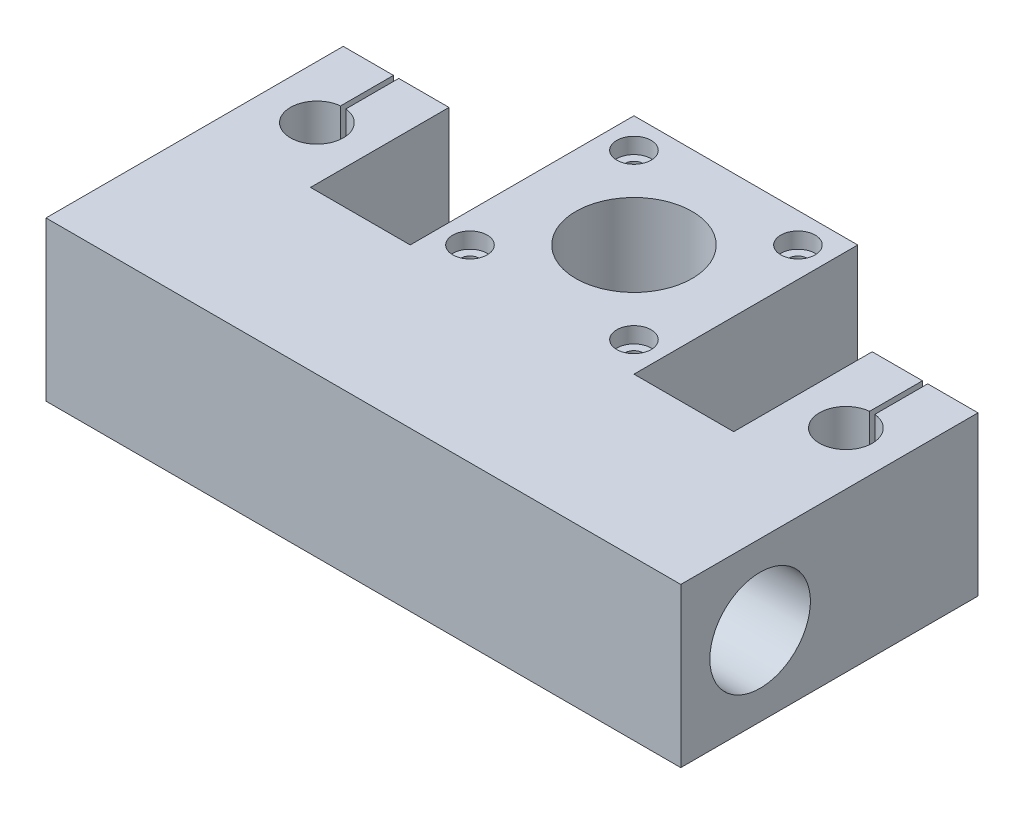
ISO-10303-21;
HEADER;
FILE_DESCRIPTION(('STEP AP214'),'2;1');
FILE_NAME('part.step','',(''),(''),'','','');
FILE_SCHEMA(('AUTOMOTIVE_DESIGN { 1 0 10303 214 1 1 1 1 }'));
ENDSEC;
DATA;
#1=APPLICATION_CONTEXT('core data for automotive mechanical design processes');
#2=APPLICATION_PROTOCOL_DEFINITION('international standard','automotive_design',2000,#1);
#3=PRODUCT_CONTEXT('',#1,'mechanical');
#4=PRODUCT('Part','Part','',(#3));
#5=PRODUCT_RELATED_PRODUCT_CATEGORY('part','',(#4));
#6=PRODUCT_DEFINITION_FORMATION('','',#4);
#7=PRODUCT_DEFINITION_CONTEXT('part definition',#1,'design');
#8=PRODUCT_DEFINITION('design','',#6,#7);
#9=PRODUCT_DEFINITION_SHAPE('','',#8);
#10=(LENGTH_UNIT() NAMED_UNIT(*) SI_UNIT(.MILLI.,.METRE.));
#11=(NAMED_UNIT(*) PLANE_ANGLE_UNIT() SI_UNIT($,.RADIAN.));
#12=(NAMED_UNIT(*) SI_UNIT($,.STERADIAN.) SOLID_ANGLE_UNIT());
#13=UNCERTAINTY_MEASURE_WITH_UNIT(LENGTH_MEASURE(1.E-05),#10,'distance_accuracy_value','');
#14=(GEOMETRIC_REPRESENTATION_CONTEXT(3) GLOBAL_UNCERTAINTY_ASSIGNED_CONTEXT((#13)) GLOBAL_UNIT_ASSIGNED_CONTEXT((#10,
#11,#12)) REPRESENTATION_CONTEXT('',''));
#15=CARTESIAN_POINT('',(0.,0.,0.));
#16=DIRECTION('',(0.,0.,1.));
#17=DIRECTION('',(1.,0.,0.));
#18=AXIS2_PLACEMENT_3D('',#15,#16,#17);
#19=CARTESIAN_POINT('',(-50.0000000000001,30.,-41.2131228704521));
#20=DIRECTION('',(0.,1.,0.));
#21=DIRECTION('',(0.,0.,1.));
#22=AXIS2_PLACEMENT_3D('',#19,#20,#21);
#23=PLANE('',#22);
#24=CARTESIAN_POINT('',(-15.5,30.,-66.65));
#25=DIRECTION('',(0.,1.,0.));
#26=DIRECTION('',(0.,0.,1.));
#27=AXIS2_PLACEMENT_3D('',#24,#25,#26);
#28=CIRCLE('',#27,3.25);
#29=CARTESIAN_POINT('',(-15.5,30.,-63.4));
#30=VERTEX_POINT('',#29);
#31=EDGE_CURVE('E404',#30,#30,#28,.T.);
#32=ORIENTED_EDGE('',*,*,#31,.F.);
#33=EDGE_LOOP('',(#32));
#34=FACE_BOUND('',#33,.T.);
#35=CARTESIAN_POINT('',(15.5,30.,-66.65));
#36=DIRECTION('',(0.,1.,0.));
#37=DIRECTION('',(0.,0.,1.));
#38=AXIS2_PLACEMENT_3D('',#35,#36,#37);
#39=CIRCLE('',#38,3.25);
#40=CARTESIAN_POINT('',(15.5,30.,-63.4));
#41=VERTEX_POINT('',#40);
#42=EDGE_CURVE('E392',#41,#41,#39,.T.);
#43=ORIENTED_EDGE('',*,*,#42,.F.);
#44=EDGE_LOOP('',(#43));
#45=FACE_BOUND('',#44,.T.);
#46=CARTESIAN_POINT('',(15.5,30.,-35.65));
#47=DIRECTION('',(0.,1.,0.));
#48=DIRECTION('',(0.,0.,1.));
#49=AXIS2_PLACEMENT_3D('',#46,#47,#48);
#50=CIRCLE('',#49,3.25);
#51=CARTESIAN_POINT('',(15.5,30.,-32.4));
#52=VERTEX_POINT('',#51);
#53=EDGE_CURVE('E380',#52,#52,#50,.T.);
#54=ORIENTED_EDGE('',*,*,#53,.F.);
#55=EDGE_LOOP('',(#54));
#56=FACE_BOUND('',#55,.T.);
#57=CARTESIAN_POINT('',(-15.5,30.,-35.65));
#58=DIRECTION('',(0.,1.,0.));
#59=DIRECTION('',(0.,0.,1.));
#60=AXIS2_PLACEMENT_3D('',#57,#58,#59);
#61=CIRCLE('',#60,3.25);
#62=CARTESIAN_POINT('',(-15.5,30.,-32.4));
#63=VERTEX_POINT('',#62);
#64=EDGE_CURVE('E368',#63,#63,#61,.T.);
#65=ORIENTED_EDGE('',*,*,#64,.F.);
#66=EDGE_LOOP('',(#65));
#67=FACE_BOUND('',#66,.T.);
#68=DIRECTION('',(1.,0.,0.));
#69=VECTOR('',#68,1.);
#70=CARTESIAN_POINT('',(60.0000000000001,30.,0.));
#71=LINE('',#70,#69);
#72=CARTESIAN_POINT('',(-60.0000000000001,30.,0.));
#73=VERTEX_POINT('',#72);
#74=CARTESIAN_POINT('',(60.0000000000001,30.,0.));
#75=VERTEX_POINT('',#74);
#76=EDGE_CURVE('E50',#73,#75,#71,.T.);
#77=ORIENTED_EDGE('',*,*,#76,.T.);
#78=DIRECTION('',(0.,0.,-1.));
#79=VECTOR('',#78,1.);
#80=CARTESIAN_POINT('',(60.0000000000001,30.,-56.1880600559852));
#81=LINE('',#80,#79);
#82=CARTESIAN_POINT('',(60.0000000000001,30.,-56.1880600559852));
#83=VERTEX_POINT('',#82);
#84=EDGE_CURVE('E130',#75,#83,#81,.T.);
#85=ORIENTED_EDGE('',*,*,#84,.T.);
#86=DIRECTION('',(-1.,0.,0.));
#87=VECTOR('',#86,1.);
#88=CARTESIAN_POINT('',(60.0000000000001,30.,-56.1880600559852));
#89=LINE('',#88,#87);
#90=CARTESIAN_POINT('',(50.5000000000001,30.,-56.1880600559852));
#91=VERTEX_POINT('',#90);
#92=EDGE_CURVE('E294',#83,#91,#89,.T.);
#93=ORIENTED_EDGE('',*,*,#92,.T.);
#94=DIRECTION('',(0.,0.,1.));
#95=VECTOR('',#94,1.);
#96=CARTESIAN_POINT('',(50.5000000000001,30.,-56.1880600559852));
#97=LINE('',#96,#95);
#98=CARTESIAN_POINT('',(50.5000000000001,30.,-46.1880600559852));
#99=VERTEX_POINT('',#98);
#100=EDGE_CURVE('E314',#91,#99,#97,.T.);
#101=ORIENTED_EDGE('',*,*,#100,.T.);
#102=CARTESIAN_POINT('',(50.,30.,-41.2131228704521));
#103=DIRECTION('',(0.,-1.,0.));
#104=DIRECTION('',(0.,0.,1.));
#105=AXIS2_PLACEMENT_3D('',#102,#103,#104);
#106=CIRCLE('',#105,5.00000000000003);
#107=CARTESIAN_POINT('',(49.5,30.,-46.1880600559852));
#108=VERTEX_POINT('',#107);
#109=EDGE_CURVE('E311',#99,#108,#106,.T.);
#110=ORIENTED_EDGE('',*,*,#109,.T.);
#111=DIRECTION('',(0.,0.,-1.));
#112=VECTOR('',#111,1.);
#113=CARTESIAN_POINT('',(49.5,30.,-56.1880600559852));
#114=LINE('',#113,#112);
#115=CARTESIAN_POINT('',(49.5,30.,-56.1880600559852));
#116=VERTEX_POINT('',#115);
#117=EDGE_CURVE('E313',#108,#116,#114,.T.);
#118=ORIENTED_EDGE('',*,*,#117,.T.);
#119=DIRECTION('',(-1.,0.,0.));
#120=VECTOR('',#119,1.);
#121=CARTESIAN_POINT('',(40.0000000000001,30.,-56.1880600559852));
#122=LINE('',#121,#120);
#123=CARTESIAN_POINT('',(40.0000000000001,30.,-56.1880600559852));
#124=VERTEX_POINT('',#123);
#125=EDGE_CURVE('E316',#116,#124,#122,.T.);
#126=ORIENTED_EDGE('',*,*,#125,.T.);
#127=DIRECTION('',(0.,0.,1.));
#128=VECTOR('',#127,1.);
#129=CARTESIAN_POINT('',(40.0000000000001,30.,-30.));
#130=LINE('',#129,#128);
#131=CARTESIAN_POINT('',(40.0000000000001,30.,-30.));
#132=VERTEX_POINT('',#131);
#133=EDGE_CURVE('E322',#124,#132,#130,.T.);
#134=ORIENTED_EDGE('',*,*,#133,.T.);
#135=DIRECTION('',(-1.,0.,0.));
#136=VECTOR('',#135,1.);
#137=CARTESIAN_POINT('',(21.15,30.,-30.));
#138=LINE('',#137,#136);
#139=CARTESIAN_POINT('',(21.15,30.,-30.));
#140=VERTEX_POINT('',#139);
#141=EDGE_CURVE('E324',#132,#140,#138,.T.);
#142=ORIENTED_EDGE('',*,*,#141,.T.);
#143=DIRECTION('',(0.,0.,-1.));
#144=VECTOR('',#143,1.);
#145=CARTESIAN_POINT('',(21.15,30.,-72.3));
#146=LINE('',#145,#144);
#147=CARTESIAN_POINT('',(21.15,30.,-72.3));
#148=VERTEX_POINT('',#147);
#149=EDGE_CURVE('E326',#140,#148,#146,.T.);
#150=ORIENTED_EDGE('',*,*,#149,.T.);
#151=DIRECTION('',(-1.,0.,0.));
#152=VECTOR('',#151,1.);
#153=CARTESIAN_POINT('',(-21.15,30.,-72.3));
#154=LINE('',#153,#152);
#155=CARTESIAN_POINT('',(-21.15,30.,-72.3));
#156=VERTEX_POINT('',#155);
#157=EDGE_CURVE('E328',#148,#156,#154,.T.);
#158=ORIENTED_EDGE('',*,*,#157,.T.);
#159=DIRECTION('',(0.,0.,1.));
#160=VECTOR('',#159,1.);
#161=CARTESIAN_POINT('',(-21.15,30.,-30.));
#162=LINE('',#161,#160);
#163=CARTESIAN_POINT('',(-21.15,30.,-30.));
#164=VERTEX_POINT('',#163);
#165=EDGE_CURVE('E330',#156,#164,#162,.T.);
#166=ORIENTED_EDGE('',*,*,#165,.T.);
#167=DIRECTION('',(-1.,0.,0.));
#168=VECTOR('',#167,1.);
#169=CARTESIAN_POINT('',(-40.0000000000001,30.,-30.));
#170=LINE('',#169,#168);
#171=CARTESIAN_POINT('',(-40.0000000000001,30.,-30.));
#172=VERTEX_POINT('',#171);
#173=EDGE_CURVE('E332',#164,#172,#170,.T.);
#174=ORIENTED_EDGE('',*,*,#173,.T.);
#175=DIRECTION('',(0.,0.,-1.));
#176=VECTOR('',#175,1.);
#177=CARTESIAN_POINT('',(-40.0000000000001,30.,-56.1880600559852));
#178=LINE('',#177,#176);
#179=CARTESIAN_POINT('',(-40.0000000000001,30.,-56.1880600559852));
#180=VERTEX_POINT('',#179);
#181=EDGE_CURVE('E334',#172,#180,#178,.T.);
#182=ORIENTED_EDGE('',*,*,#181,.T.);
#183=DIRECTION('',(-1.,0.,0.));
#184=VECTOR('',#183,1.);
#185=CARTESIAN_POINT('',(-40.0000000000001,30.,-56.1880600559852));
#186=LINE('',#185,#184);
#187=CARTESIAN_POINT('',(-49.5000000000001,30.,-56.1880600559852));
#188=VERTEX_POINT('',#187);
#189=EDGE_CURVE('E336',#180,#188,#186,.T.);
#190=ORIENTED_EDGE('',*,*,#189,.T.);
#191=DIRECTION('',(0.,0.,1.));
#192=VECTOR('',#191,1.);
#193=CARTESIAN_POINT('',(-49.5000000000001,30.,-56.1880600559852));
#194=LINE('',#193,#192);
#195=CARTESIAN_POINT('',(-49.5000000000001,30.,-46.1880600559852));
#196=VERTEX_POINT('',#195);
#197=EDGE_CURVE('E338',#188,#196,#194,.T.);
#198=ORIENTED_EDGE('',*,*,#197,.T.);
#199=CARTESIAN_POINT('',(-50.0000000000001,30.,-41.2131228704521));
#200=DIRECTION('',(0.,-1.,0.));
#201=DIRECTION('',(0.,0.,1.));
#202=AXIS2_PLACEMENT_3D('',#199,#200,#201);
#203=CIRCLE('',#202,4.99999999999999);
#204=CARTESIAN_POINT('',(-50.5000000000001,30.,-46.1880600559852));
#205=VERTEX_POINT('',#204);
#206=EDGE_CURVE('E186',#196,#205,#203,.T.);
#207=ORIENTED_EDGE('',*,*,#206,.T.);
#208=DIRECTION('',(0.,0.,-1.));
#209=VECTOR('',#208,1.);
#210=CARTESIAN_POINT('',(-50.5000000000001,30.,-56.1880600559852));
#211=LINE('',#210,#209);
#212=CARTESIAN_POINT('',(-50.5000000000001,30.,-56.1880600559852));
#213=VERTEX_POINT('',#212);
#214=EDGE_CURVE('E180',#205,#213,#211,.T.);
#215=ORIENTED_EDGE('',*,*,#214,.T.);
#216=DIRECTION('',(-1.,0.,0.));
#217=VECTOR('',#216,1.);
#218=CARTESIAN_POINT('',(-60.0000000000001,30.,-56.1880600559852));
#219=LINE('',#218,#217);
#220=CARTESIAN_POINT('',(-60.0000000000001,30.,-56.1880600559852));
#221=VERTEX_POINT('',#220);
#222=EDGE_CURVE('E184',#213,#221,#219,.T.);
#223=ORIENTED_EDGE('',*,*,#222,.T.);
#224=DIRECTION('',(0.,0.,1.));
#225=VECTOR('',#224,1.);
#226=CARTESIAN_POINT('',(-60.0000000000001,30.,0.));
#227=LINE('',#226,#225);
#228=EDGE_CURVE('E200',#221,#73,#227,.T.);
#229=ORIENTED_EDGE('',*,*,#228,.T.);
#230=EDGE_LOOP('',(#77,#85,#93,#101,#110,#118,#126,#134,#142,#150,#158,#166,#174,#182,#190,#198,
#207,#215,#223,#229));
#231=FACE_BOUND('',#230,.T.);
#232=CARTESIAN_POINT('',(0.,30.,-51.15));
#233=DIRECTION('',(0.,1.,0.));
#234=DIRECTION('',(0.,0.,1.));
#235=AXIS2_PLACEMENT_3D('',#232,#233,#234);
#236=CIRCLE('',#235,11.);
#237=CARTESIAN_POINT('',(0.,30.,-40.15));
#238=VERTEX_POINT('',#237);
#239=EDGE_CURVE('E209',#238,#238,#236,.T.);
#240=ORIENTED_EDGE('',*,*,#239,.F.);
#241=EDGE_LOOP('',(#240));
#242=FACE_BOUND('',#241,.T.);
#243=ADVANCED_FACE('F33',(#34,#45,#56,#67,#231,#242),#23,.T.);
#244=CARTESIAN_POINT('',(-50.0000000000001,0.,-41.2131228704521));
#245=DIRECTION('',(0.,1.,0.));
#246=DIRECTION('',(0.,0.,1.));
#247=AXIS2_PLACEMENT_3D('',#244,#245,#246);
#248=PLANE('',#247);
#249=CARTESIAN_POINT('',(-15.5,0.,-66.65));
#250=DIRECTION('',(0.,1.,0.));
#251=DIRECTION('',(0.,0.,1.));
#252=AXIS2_PLACEMENT_3D('',#249,#250,#251);
#253=CIRCLE('',#252,1.69999999999999);
#254=CARTESIAN_POINT('',(-15.5,0.,-64.95));
#255=VERTEX_POINT('',#254);
#256=EDGE_CURVE('E395',#255,#255,#253,.T.);
#257=ORIENTED_EDGE('',*,*,#256,.T.);
#258=EDGE_LOOP('',(#257));
#259=FACE_BOUND('',#258,.T.);
#260=CARTESIAN_POINT('',(15.5,0.,-66.65));
#261=DIRECTION('',(0.,1.,0.));
#262=DIRECTION('',(0.,0.,1.));
#263=AXIS2_PLACEMENT_3D('',#260,#261,#262);
#264=CIRCLE('',#263,1.69999999999999);
#265=CARTESIAN_POINT('',(15.5,0.,-64.95));
#266=VERTEX_POINT('',#265);
#267=EDGE_CURVE('E383',#266,#266,#264,.T.);
#268=ORIENTED_EDGE('',*,*,#267,.T.);
#269=EDGE_LOOP('',(#268));
#270=FACE_BOUND('',#269,.T.);
#271=CARTESIAN_POINT('',(15.5,0.,-35.65));
#272=DIRECTION('',(0.,1.,0.));
#273=DIRECTION('',(0.,0.,1.));
#274=AXIS2_PLACEMENT_3D('',#271,#272,#273);
#275=CIRCLE('',#274,1.69999999999999);
#276=CARTESIAN_POINT('',(15.5,0.,-33.95));
#277=VERTEX_POINT('',#276);
#278=EDGE_CURVE('E371',#277,#277,#275,.T.);
#279=ORIENTED_EDGE('',*,*,#278,.T.);
#280=EDGE_LOOP('',(#279));
#281=FACE_BOUND('',#280,.T.);
#282=CARTESIAN_POINT('',(-15.5,0.,-35.65));
#283=DIRECTION('',(0.,1.,0.));
#284=DIRECTION('',(0.,0.,1.));
#285=AXIS2_PLACEMENT_3D('',#282,#283,#284);
#286=CIRCLE('',#285,1.69999999999999);
#287=CARTESIAN_POINT('',(-15.5,0.,-33.95));
#288=VERTEX_POINT('',#287);
#289=EDGE_CURVE('E357',#288,#288,#286,.T.);
#290=ORIENTED_EDGE('',*,*,#289,.T.);
#291=EDGE_LOOP('',(#290));
#292=FACE_BOUND('',#291,.T.);
#293=DIRECTION('',(0.,0.,-1.));
#294=VECTOR('',#293,1.);
#295=CARTESIAN_POINT('',(60.0000000000001,0.,-56.1880600559852));
#296=LINE('',#295,#294);
#297=CARTESIAN_POINT('',(60.0000000000001,0.,0.));
#298=VERTEX_POINT('',#297);
#299=CARTESIAN_POINT('',(60.0000000000001,0.,-56.1880600559852));
#300=VERTEX_POINT('',#299);
#301=EDGE_CURVE('E206',#298,#300,#296,.T.);
#302=ORIENTED_EDGE('',*,*,#301,.F.);
#303=DIRECTION('',(1.,0.,0.));
#304=VECTOR('',#303,1.);
#305=CARTESIAN_POINT('',(0.,0.,0.));
#306=LINE('',#305,#304);
#307=CARTESIAN_POINT('',(-60.0000000000001,0.,0.));
#308=VERTEX_POINT('',#307);
#309=EDGE_CURVE('E242',#308,#298,#306,.T.);
#310=ORIENTED_EDGE('',*,*,#309,.F.);
#311=DIRECTION('',(0.,0.,1.));
#312=VECTOR('',#311,1.);
#313=CARTESIAN_POINT('',(-60.0000000000001,0.,0.));
#314=LINE('',#313,#312);
#315=CARTESIAN_POINT('',(-60.0000000000001,0.,-56.1880600559852));
#316=VERTEX_POINT('',#315);
#317=EDGE_CURVE('E123',#316,#308,#314,.T.);
#318=ORIENTED_EDGE('',*,*,#317,.F.);
#319=DIRECTION('',(-1.,0.,0.));
#320=VECTOR('',#319,1.);
#321=CARTESIAN_POINT('',(-60.0000000000001,0.,-56.1880600559852));
#322=LINE('',#321,#320);
#323=CARTESIAN_POINT('',(-50.5000000000001,0.,-56.1880600559852));
#324=VERTEX_POINT('',#323);
#325=EDGE_CURVE('E116',#324,#316,#322,.T.);
#326=ORIENTED_EDGE('',*,*,#325,.F.);
#327=DIRECTION('',(0.,0.,-1.));
#328=VECTOR('',#327,1.);
#329=CARTESIAN_POINT('',(-50.5000000000001,0.,-56.1880600559852));
#330=LINE('',#329,#328);
#331=CARTESIAN_POINT('',(-50.5000000000001,0.,-46.1880600559852));
#332=VERTEX_POINT('',#331);
#333=EDGE_CURVE('E194',#332,#324,#330,.T.);
#334=ORIENTED_EDGE('',*,*,#333,.F.);
#335=CARTESIAN_POINT('',(-50.0000000000001,0.,-41.2131228704521));
#336=DIRECTION('',(0.,-1.,0.));
#337=DIRECTION('',(0.,0.,1.));
#338=AXIS2_PLACEMENT_3D('',#335,#336,#337);
#339=CIRCLE('',#338,4.99999999999999);
#340=CARTESIAN_POINT('',(-49.5000000000001,0.,-46.1880600559852));
#341=VERTEX_POINT('',#340);
#342=EDGE_CURVE('E237',#341,#332,#339,.T.);
#343=ORIENTED_EDGE('',*,*,#342,.F.);
#344=DIRECTION('',(0.,0.,1.));
#345=VECTOR('',#344,1.);
#346=CARTESIAN_POINT('',(-49.5000000000001,0.,-56.1880600559852));
#347=LINE('',#346,#345);
#348=CARTESIAN_POINT('',(-49.5000000000001,0.,-56.1880600559852));
#349=VERTEX_POINT('',#348);
#350=EDGE_CURVE('E235',#349,#341,#347,.T.);
#351=ORIENTED_EDGE('',*,*,#350,.F.);
#352=DIRECTION('',(-1.,0.,0.));
#353=VECTOR('',#352,1.);
#354=CARTESIAN_POINT('',(-40.0000000000001,0.,-56.1880600559852));
#355=LINE('',#354,#353);
#356=CARTESIAN_POINT('',(-40.0000000000001,0.,-56.1880600559852));
#357=VERTEX_POINT('',#356);
#358=EDGE_CURVE('E233',#357,#349,#355,.T.);
#359=ORIENTED_EDGE('',*,*,#358,.F.);
#360=DIRECTION('',(0.,0.,-1.));
#361=VECTOR('',#360,1.);
#362=CARTESIAN_POINT('',(-40.0000000000001,0.,-56.1880600559852));
#363=LINE('',#362,#361);
#364=CARTESIAN_POINT('',(-40.0000000000001,0.,-30.));
#365=VERTEX_POINT('',#364);
#366=EDGE_CURVE('E231',#365,#357,#363,.T.);
#367=ORIENTED_EDGE('',*,*,#366,.F.);
#368=DIRECTION('',(-1.,0.,0.));
#369=VECTOR('',#368,1.);
#370=CARTESIAN_POINT('',(-40.0000000000001,0.,-30.));
#371=LINE('',#370,#369);
#372=CARTESIAN_POINT('',(-21.15,0.,-30.));
#373=VERTEX_POINT('',#372);
#374=EDGE_CURVE('E229',#373,#365,#371,.T.);
#375=ORIENTED_EDGE('',*,*,#374,.F.);
#376=DIRECTION('',(0.,0.,1.));
#377=VECTOR('',#376,1.);
#378=CARTESIAN_POINT('',(-21.15,0.,-30.));
#379=LINE('',#378,#377);
#380=CARTESIAN_POINT('',(-21.15,0.,-72.3));
#381=VERTEX_POINT('',#380);
#382=EDGE_CURVE('E227',#381,#373,#379,.T.);
#383=ORIENTED_EDGE('',*,*,#382,.F.);
#384=DIRECTION('',(-1.,0.,0.));
#385=VECTOR('',#384,1.);
#386=CARTESIAN_POINT('',(-21.15,0.,-72.3));
#387=LINE('',#386,#385);
#388=CARTESIAN_POINT('',(21.15,0.,-72.3));
#389=VERTEX_POINT('',#388);
#390=EDGE_CURVE('E225',#389,#381,#387,.T.);
#391=ORIENTED_EDGE('',*,*,#390,.F.);
#392=DIRECTION('',(0.,0.,-1.));
#393=VECTOR('',#392,1.);
#394=CARTESIAN_POINT('',(21.15,0.,-72.3));
#395=LINE('',#394,#393);
#396=CARTESIAN_POINT('',(21.15,0.,-30.));
#397=VERTEX_POINT('',#396);
#398=EDGE_CURVE('E223',#397,#389,#395,.T.);
#399=ORIENTED_EDGE('',*,*,#398,.F.);
#400=DIRECTION('',(-1.,0.,0.));
#401=VECTOR('',#400,1.);
#402=CARTESIAN_POINT('',(21.15,0.,-30.));
#403=LINE('',#402,#401);
#404=CARTESIAN_POINT('',(40.0000000000001,0.,-30.));
#405=VERTEX_POINT('',#404);
#406=EDGE_CURVE('E221',#405,#397,#403,.T.);
#407=ORIENTED_EDGE('',*,*,#406,.F.);
#408=DIRECTION('',(0.,0.,1.));
#409=VECTOR('',#408,1.);
#410=CARTESIAN_POINT('',(40.0000000000001,0.,-30.));
#411=LINE('',#410,#409);
#412=CARTESIAN_POINT('',(40.0000000000001,0.,-56.1880600559852));
#413=VERTEX_POINT('',#412);
#414=EDGE_CURVE('E219',#413,#405,#411,.T.);
#415=ORIENTED_EDGE('',*,*,#414,.F.);
#416=DIRECTION('',(-1.,0.,0.));
#417=VECTOR('',#416,1.);
#418=CARTESIAN_POINT('',(40.0000000000001,0.,-56.1880600559852));
#419=LINE('',#418,#417);
#420=CARTESIAN_POINT('',(49.5,0.,-56.1880600559852));
#421=VERTEX_POINT('',#420);
#422=EDGE_CURVE('E217',#421,#413,#419,.T.);
#423=ORIENTED_EDGE('',*,*,#422,.F.);
#424=DIRECTION('',(0.,0.,-1.));
#425=VECTOR('',#424,1.);
#426=CARTESIAN_POINT('',(49.5,0.,-56.1880600559852));
#427=LINE('',#426,#425);
#428=CARTESIAN_POINT('',(49.5,0.,-46.1880600559852));
#429=VERTEX_POINT('',#428);
#430=EDGE_CURVE('E215',#429,#421,#427,.T.);
#431=ORIENTED_EDGE('',*,*,#430,.F.);
#432=CARTESIAN_POINT('',(50.,0.,-41.2131228704521));
#433=DIRECTION('',(0.,-1.,0.));
#434=DIRECTION('',(0.,0.,1.));
#435=AXIS2_PLACEMENT_3D('',#432,#433,#434);
#436=CIRCLE('',#435,5.00000000000003);
#437=CARTESIAN_POINT('',(50.5000000000001,0.,-46.1880600559852));
#438=VERTEX_POINT('',#437);
#439=EDGE_CURVE('E213',#438,#429,#436,.T.);
#440=ORIENTED_EDGE('',*,*,#439,.F.);
#441=DIRECTION('',(0.,0.,1.));
#442=VECTOR('',#441,1.);
#443=CARTESIAN_POINT('',(50.5000000000001,0.,-56.1880600559852));
#444=LINE('',#443,#442);
#445=CARTESIAN_POINT('',(50.5000000000001,0.,-56.1880600559852));
#446=VERTEX_POINT('',#445);
#447=EDGE_CURVE('E211',#446,#438,#444,.T.);
#448=ORIENTED_EDGE('',*,*,#447,.F.);
#449=DIRECTION('',(-1.,0.,0.));
#450=VECTOR('',#449,1.);
#451=CARTESIAN_POINT('',(60.0000000000001,0.,-56.1880600559852));
#452=LINE('',#451,#450);
#453=EDGE_CURVE('E208',#300,#446,#452,.T.);
#454=ORIENTED_EDGE('',*,*,#453,.F.);
#455=EDGE_LOOP('',(#302,#310,#318,#326,#334,#343,#351,#359,#367,#375,#383,#391,#399,#407,#415,
#423,#431,#440,#448,#454));
#456=FACE_BOUND('',#455,.T.);
#457=CARTESIAN_POINT('',(0.,0.,-51.15));
#458=DIRECTION('',(0.,1.,0.));
#459=DIRECTION('',(0.,0.,1.));
#460=AXIS2_PLACEMENT_3D('',#457,#458,#459);
#461=CIRCLE('',#460,11.);
#462=CARTESIAN_POINT('',(0.,0.,-40.15));
#463=VERTEX_POINT('',#462);
#464=EDGE_CURVE('E354',#463,#463,#461,.T.);
#465=ORIENTED_EDGE('',*,*,#464,.T.);
#466=EDGE_LOOP('',(#465));
#467=FACE_BOUND('',#466,.T.);
#468=ADVANCED_FACE('F298',(#259,#270,#281,#292,#456,#467),#248,.F.);
#469=CARTESIAN_POINT('',(60.0000000000001,30.,-56.1880600559852));
#470=DIRECTION('',(-1.,0.,0.));
#471=DIRECTION('',(0.,0.,1.));
#472=AXIS2_PLACEMENT_3D('',#469,#470,#471);
#473=PLANE('',#472);
#474=CARTESIAN_POINT('',(60.0000000000001,15.,-15.));
#475=DIRECTION('',(-1.,0.,0.));
#476=DIRECTION('',(0.,0.,1.));
#477=AXIS2_PLACEMENT_3D('',#474,#475,#476);
#478=CIRCLE('',#477,9.5);
#479=CARTESIAN_POINT('',(60.0000000000001,15.,-5.49999999999999));
#480=VERTEX_POINT('',#479);
#481=EDGE_CURVE('E407',#480,#480,#478,.T.);
#482=ORIENTED_EDGE('',*,*,#481,.T.);
#483=EDGE_LOOP('',(#482));
#484=FACE_BOUND('',#483,.T.);
#485=ORIENTED_EDGE('',*,*,#301,.T.);
#486=DIRECTION('',(0.,-1.,0.));
#487=VECTOR('',#486,1.);
#488=CARTESIAN_POINT('',(60.0000000000001,30.,-56.1880600559852));
#489=LINE('',#488,#487);
#490=EDGE_CURVE('E42',#83,#300,#489,.T.);
#491=ORIENTED_EDGE('',*,*,#490,.F.);
#492=ORIENTED_EDGE('',*,*,#84,.F.);
#493=DIRECTION('',(0.,-1.,0.));
#494=VECTOR('',#493,1.);
#495=CARTESIAN_POINT('',(60.0000000000001,30.,0.));
#496=LINE('',#495,#494);
#497=EDGE_CURVE('E11',#75,#298,#496,.T.);
#498=ORIENTED_EDGE('',*,*,#497,.T.);
#499=EDGE_LOOP('',(#485,#491,#492,#498));
#500=FACE_BOUND('',#499,.T.);
#501=ADVANCED_FACE('F35',(#484,#500),#473,.F.);
#502=CARTESIAN_POINT('',(60.0000000000001,30.,-56.1880600559852));
#503=DIRECTION('',(0.,0.,1.));
#504=DIRECTION('',(1.,0.,0.));
#505=AXIS2_PLACEMENT_3D('',#502,#503,#504);
#506=PLANE('',#505);
#507=ORIENTED_EDGE('',*,*,#453,.T.);
#508=DIRECTION('',(0.,-1.,0.));
#509=VECTOR('',#508,1.);
#510=CARTESIAN_POINT('',(50.5000000000001,30.,-56.1880600559852));
#511=LINE('',#510,#509);
#512=EDGE_CURVE('E286',#91,#446,#511,.T.);
#513=ORIENTED_EDGE('',*,*,#512,.F.);
#514=ORIENTED_EDGE('',*,*,#92,.F.);
#515=ORIENTED_EDGE('',*,*,#490,.T.);
#516=EDGE_LOOP('',(#507,#513,#514,#515));
#517=FACE_BOUND('',#516,.T.);
#518=ADVANCED_FACE('F292',(#517),#506,.F.);
#519=CARTESIAN_POINT('',(50.5000000000001,30.,-56.1880600559852));
#520=DIRECTION('',(1.,0.,0.));
#521=DIRECTION('',(0.,0.,-1.));
#522=AXIS2_PLACEMENT_3D('',#519,#520,#521);
#523=PLANE('',#522);
#524=ORIENTED_EDGE('',*,*,#447,.T.);
#525=DIRECTION('',(0.,-1.,0.));
#526=VECTOR('',#525,1.);
#527=CARTESIAN_POINT('',(50.5000000000001,30.,-46.1880600559852));
#528=LINE('',#527,#526);
#529=EDGE_CURVE('E283',#99,#438,#528,.T.);
#530=ORIENTED_EDGE('',*,*,#529,.F.);
#531=ORIENTED_EDGE('',*,*,#100,.F.);
#532=ORIENTED_EDGE('',*,*,#512,.T.);
#533=EDGE_LOOP('',(#524,#530,#531,#532));
#534=FACE_BOUND('',#533,.T.);
#535=ADVANCED_FACE('F305',(#534),#523,.F.);
#536=CARTESIAN_POINT('',(50.,30.,-41.2131228704521));
#537=DIRECTION('',(0.,-1.,0.));
#538=DIRECTION('',(0.,0.,-1.));
#539=AXIS2_PLACEMENT_3D('',#536,#537,#538);
#540=CYLINDRICAL_SURFACE('',#539,5.00000000000003);
#541=ORIENTED_EDGE('',*,*,#439,.T.);
#542=DIRECTION('',(0.,-1.,0.));
#543=VECTOR('',#542,1.);
#544=CARTESIAN_POINT('',(49.5,30.,-46.1880600559852));
#545=LINE('',#544,#543);
#546=EDGE_CURVE('E280',#108,#429,#545,.T.);
#547=ORIENTED_EDGE('',*,*,#546,.F.);
#548=ORIENTED_EDGE('',*,*,#109,.F.);
#549=ORIENTED_EDGE('',*,*,#529,.T.);
#550=EDGE_LOOP('',(#541,#547,#548,#549));
#551=FACE_BOUND('',#550,.T.);
#552=ADVANCED_FACE('F309',(#551),#540,.F.);
#553=CARTESIAN_POINT('',(49.5,30.,-56.1880600559852));
#554=DIRECTION('',(-1.,0.,0.));
#555=DIRECTION('',(0.,0.,1.));
#556=AXIS2_PLACEMENT_3D('',#553,#554,#555);
#557=PLANE('',#556);
#558=ORIENTED_EDGE('',*,*,#430,.T.);
#559=DIRECTION('',(0.,-1.,0.));
#560=VECTOR('',#559,1.);
#561=CARTESIAN_POINT('',(49.5,30.,-56.1880600559852));
#562=LINE('',#561,#560);
#563=EDGE_CURVE('E277',#116,#421,#562,.T.);
#564=ORIENTED_EDGE('',*,*,#563,.F.);
#565=ORIENTED_EDGE('',*,*,#117,.F.);
#566=ORIENTED_EDGE('',*,*,#546,.T.);
#567=EDGE_LOOP('',(#558,#564,#565,#566));
#568=FACE_BOUND('',#567,.T.);
#569=ADVANCED_FACE('F537',(#568),#557,.F.);
#570=CARTESIAN_POINT('',(40.0000000000001,30.,-56.1880600559852));
#571=DIRECTION('',(0.,0.,1.));
#572=DIRECTION('',(1.,0.,0.));
#573=AXIS2_PLACEMENT_3D('',#570,#571,#572);
#574=PLANE('',#573);
#575=ORIENTED_EDGE('',*,*,#422,.T.);
#576=DIRECTION('',(0.,-1.,0.));
#577=VECTOR('',#576,1.);
#578=CARTESIAN_POINT('',(40.0000000000001,30.,-56.1880600559852));
#579=LINE('',#578,#577);
#580=EDGE_CURVE('E274',#124,#413,#579,.T.);
#581=ORIENTED_EDGE('',*,*,#580,.F.);
#582=ORIENTED_EDGE('',*,*,#125,.F.);
#583=ORIENTED_EDGE('',*,*,#563,.T.);
#584=EDGE_LOOP('',(#575,#581,#582,#583));
#585=FACE_BOUND('',#584,.T.);
#586=ADVANCED_FACE('F544',(#585),#574,.F.);
#587=CARTESIAN_POINT('',(40.0000000000001,30.,-30.));
#588=DIRECTION('',(1.,0.,0.));
#589=DIRECTION('',(0.,0.,-1.));
#590=AXIS2_PLACEMENT_3D('',#587,#588,#589);
#591=PLANE('',#590);
#592=ORIENTED_EDGE('',*,*,#414,.T.);
#593=DIRECTION('',(0.,-1.,0.));
#594=VECTOR('',#593,1.);
#595=CARTESIAN_POINT('',(40.0000000000001,30.,-30.));
#596=LINE('',#595,#594);
#597=EDGE_CURVE('E271',#132,#405,#596,.T.);
#598=ORIENTED_EDGE('',*,*,#597,.F.);
#599=ORIENTED_EDGE('',*,*,#133,.F.);
#600=ORIENTED_EDGE('',*,*,#580,.T.);
#601=EDGE_LOOP('',(#592,#598,#599,#600));
#602=FACE_BOUND('',#601,.T.);
#603=ADVANCED_FACE('F552',(#602),#591,.F.);
#604=CARTESIAN_POINT('',(21.15,30.,-30.));
#605=DIRECTION('',(0.,0.,1.));
#606=DIRECTION('',(1.,0.,0.));
#607=AXIS2_PLACEMENT_3D('',#604,#605,#606);
#608=PLANE('',#607);
#609=ORIENTED_EDGE('',*,*,#406,.T.);
#610=DIRECTION('',(0.,-1.,0.));
#611=VECTOR('',#610,1.);
#612=CARTESIAN_POINT('',(21.15,30.,-30.));
#613=LINE('',#612,#611);
#614=EDGE_CURVE('E268',#140,#397,#613,.T.);
#615=ORIENTED_EDGE('',*,*,#614,.F.);
#616=ORIENTED_EDGE('',*,*,#141,.F.);
#617=ORIENTED_EDGE('',*,*,#597,.T.);
#618=EDGE_LOOP('',(#609,#615,#616,#617));
#619=FACE_BOUND('',#618,.T.);
#620=ADVANCED_FACE('F560',(#619),#608,.F.);
#621=CARTESIAN_POINT('',(21.15,30.,-72.3));
#622=DIRECTION('',(-1.,0.,0.));
#623=DIRECTION('',(0.,0.,1.));
#624=AXIS2_PLACEMENT_3D('',#621,#622,#623);
#625=PLANE('',#624);
#626=ORIENTED_EDGE('',*,*,#398,.T.);
#627=DIRECTION('',(0.,-1.,0.));
#628=VECTOR('',#627,1.);
#629=CARTESIAN_POINT('',(21.15,30.,-72.3));
#630=LINE('',#629,#628);
#631=EDGE_CURVE('E265',#148,#389,#630,.T.);
#632=ORIENTED_EDGE('',*,*,#631,.F.);
#633=ORIENTED_EDGE('',*,*,#149,.F.);
#634=ORIENTED_EDGE('',*,*,#614,.T.);
#635=EDGE_LOOP('',(#626,#632,#633,#634));
#636=FACE_BOUND('',#635,.T.);
#637=ADVANCED_FACE('F568',(#636),#625,.F.);
#638=CARTESIAN_POINT('',(-21.15,30.,-72.3));
#639=DIRECTION('',(0.,0.,1.));
#640=DIRECTION('',(1.,0.,0.));
#641=AXIS2_PLACEMENT_3D('',#638,#639,#640);
#642=PLANE('',#641);
#643=ORIENTED_EDGE('',*,*,#390,.T.);
#644=DIRECTION('',(0.,-1.,0.));
#645=VECTOR('',#644,1.);
#646=CARTESIAN_POINT('',(-21.15,30.,-72.3));
#647=LINE('',#646,#645);
#648=EDGE_CURVE('E262',#156,#381,#647,.T.);
#649=ORIENTED_EDGE('',*,*,#648,.F.);
#650=ORIENTED_EDGE('',*,*,#157,.F.);
#651=ORIENTED_EDGE('',*,*,#631,.T.);
#652=EDGE_LOOP('',(#643,#649,#650,#651));
#653=FACE_BOUND('',#652,.T.);
#654=ADVANCED_FACE('F576',(#653),#642,.F.);
#655=CARTESIAN_POINT('',(-21.15,30.,-30.));
#656=DIRECTION('',(1.,0.,0.));
#657=DIRECTION('',(0.,0.,-1.));
#658=AXIS2_PLACEMENT_3D('',#655,#656,#657);
#659=PLANE('',#658);
#660=ORIENTED_EDGE('',*,*,#382,.T.);
#661=DIRECTION('',(0.,-1.,0.));
#662=VECTOR('',#661,1.);
#663=CARTESIAN_POINT('',(-21.15,30.,-30.));
#664=LINE('',#663,#662);
#665=EDGE_CURVE('E259',#164,#373,#664,.T.);
#666=ORIENTED_EDGE('',*,*,#665,.F.);
#667=ORIENTED_EDGE('',*,*,#165,.F.);
#668=ORIENTED_EDGE('',*,*,#648,.T.);
#669=EDGE_LOOP('',(#660,#666,#667,#668));
#670=FACE_BOUND('',#669,.T.);
#671=ADVANCED_FACE('F584',(#670),#659,.F.);
#672=CARTESIAN_POINT('',(-40.0000000000001,30.,-30.));
#673=DIRECTION('',(0.,0.,1.));
#674=DIRECTION('',(1.,0.,0.));
#675=AXIS2_PLACEMENT_3D('',#672,#673,#674);
#676=PLANE('',#675);
#677=ORIENTED_EDGE('',*,*,#374,.T.);
#678=DIRECTION('',(0.,-1.,0.));
#679=VECTOR('',#678,1.);
#680=CARTESIAN_POINT('',(-40.0000000000001,30.,-30.));
#681=LINE('',#680,#679);
#682=EDGE_CURVE('E256',#172,#365,#681,.T.);
#683=ORIENTED_EDGE('',*,*,#682,.F.);
#684=ORIENTED_EDGE('',*,*,#173,.F.);
#685=ORIENTED_EDGE('',*,*,#665,.T.);
#686=EDGE_LOOP('',(#677,#683,#684,#685));
#687=FACE_BOUND('',#686,.T.);
#688=ADVANCED_FACE('F592',(#687),#676,.F.);
#689=CARTESIAN_POINT('',(-40.0000000000001,30.,-56.1880600559852));
#690=DIRECTION('',(-1.,0.,0.));
#691=DIRECTION('',(0.,0.,1.));
#692=AXIS2_PLACEMENT_3D('',#689,#690,#691);
#693=PLANE('',#692);
#694=ORIENTED_EDGE('',*,*,#366,.T.);
#695=DIRECTION('',(0.,-1.,0.));
#696=VECTOR('',#695,1.);
#697=CARTESIAN_POINT('',(-40.0000000000001,30.,-56.1880600559852));
#698=LINE('',#697,#696);
#699=EDGE_CURVE('E253',#180,#357,#698,.T.);
#700=ORIENTED_EDGE('',*,*,#699,.F.);
#701=ORIENTED_EDGE('',*,*,#181,.F.);
#702=ORIENTED_EDGE('',*,*,#682,.T.);
#703=EDGE_LOOP('',(#694,#700,#701,#702));
#704=FACE_BOUND('',#703,.T.);
#705=ADVANCED_FACE('F600',(#704),#693,.F.);
#706=CARTESIAN_POINT('',(-40.0000000000001,30.,-56.1880600559852));
#707=DIRECTION('',(0.,0.,1.));
#708=DIRECTION('',(1.,0.,0.));
#709=AXIS2_PLACEMENT_3D('',#706,#707,#708);
#710=PLANE('',#709);
#711=ORIENTED_EDGE('',*,*,#358,.T.);
#712=DIRECTION('',(0.,-1.,0.));
#713=VECTOR('',#712,1.);
#714=CARTESIAN_POINT('',(-49.5000000000001,30.,-56.1880600559852));
#715=LINE('',#714,#713);
#716=EDGE_CURVE('E250',#188,#349,#715,.T.);
#717=ORIENTED_EDGE('',*,*,#716,.F.);
#718=ORIENTED_EDGE('',*,*,#189,.F.);
#719=ORIENTED_EDGE('',*,*,#699,.T.);
#720=EDGE_LOOP('',(#711,#717,#718,#719));
#721=FACE_BOUND('',#720,.T.);
#722=ADVANCED_FACE('F608',(#721),#710,.F.);
#723=CARTESIAN_POINT('',(-49.5000000000001,30.,-56.1880600559852));
#724=DIRECTION('',(1.,0.,0.));
#725=DIRECTION('',(0.,0.,-1.));
#726=AXIS2_PLACEMENT_3D('',#723,#724,#725);
#727=PLANE('',#726);
#728=ORIENTED_EDGE('',*,*,#350,.T.);
#729=DIRECTION('',(0.,-1.,0.));
#730=VECTOR('',#729,1.);
#731=CARTESIAN_POINT('',(-49.5000000000001,30.,-46.1880600559852));
#732=LINE('',#731,#730);
#733=EDGE_CURVE('E247',#196,#341,#732,.T.);
#734=ORIENTED_EDGE('',*,*,#733,.F.);
#735=ORIENTED_EDGE('',*,*,#197,.F.);
#736=ORIENTED_EDGE('',*,*,#716,.T.);
#737=EDGE_LOOP('',(#728,#734,#735,#736));
#738=FACE_BOUND('',#737,.T.);
#739=ADVANCED_FACE('F344',(#738),#727,.F.);
#740=CARTESIAN_POINT('',(-50.0000000000001,30.,-41.2131228704521));
#741=DIRECTION('',(0.,-1.,0.));
#742=DIRECTION('',(0.,0.,-1.));
#743=AXIS2_PLACEMENT_3D('',#740,#741,#742);
#744=CYLINDRICAL_SURFACE('',#743,4.99999999999999);
#745=ORIENTED_EDGE('',*,*,#342,.T.);
#746=DIRECTION('',(0.,-1.,0.));
#747=VECTOR('',#746,1.);
#748=CARTESIAN_POINT('',(-50.5000000000001,30.,-46.1880600559852));
#749=LINE('',#748,#747);
#750=EDGE_CURVE('E195',#205,#332,#749,.T.);
#751=ORIENTED_EDGE('',*,*,#750,.F.);
#752=ORIENTED_EDGE('',*,*,#206,.F.);
#753=ORIENTED_EDGE('',*,*,#733,.T.);
#754=EDGE_LOOP('',(#745,#751,#752,#753));
#755=FACE_BOUND('',#754,.T.);
#756=ADVANCED_FACE('F348',(#755),#744,.F.);
#757=CARTESIAN_POINT('',(-50.5000000000001,30.,-56.1880600559852));
#758=DIRECTION('',(-1.,0.,0.));
#759=DIRECTION('',(0.,0.,1.));
#760=AXIS2_PLACEMENT_3D('',#757,#758,#759);
#761=PLANE('',#760);
#762=ORIENTED_EDGE('',*,*,#333,.T.);
#763=DIRECTION('',(0.,-1.,0.));
#764=VECTOR('',#763,1.);
#765=CARTESIAN_POINT('',(-50.5000000000001,30.,-56.1880600559852));
#766=LINE('',#765,#764);
#767=EDGE_CURVE('E191',#213,#324,#766,.T.);
#768=ORIENTED_EDGE('',*,*,#767,.F.);
#769=ORIENTED_EDGE('',*,*,#214,.F.);
#770=ORIENTED_EDGE('',*,*,#750,.T.);
#771=EDGE_LOOP('',(#762,#768,#769,#770));
#772=FACE_BOUND('',#771,.T.);
#773=ADVANCED_FACE('F192',(#772),#761,.F.);
#774=CARTESIAN_POINT('',(-60.0000000000001,30.,-56.1880600559852));
#775=DIRECTION('',(0.,0.,1.));
#776=DIRECTION('',(1.,0.,0.));
#777=AXIS2_PLACEMENT_3D('',#774,#775,#776);
#778=PLANE('',#777);
#779=ORIENTED_EDGE('',*,*,#325,.T.);
#780=DIRECTION('',(0.,-1.,0.));
#781=VECTOR('',#780,1.);
#782=CARTESIAN_POINT('',(-60.0000000000001,30.,-56.1880600559852));
#783=LINE('',#782,#781);
#784=EDGE_CURVE('E196',#221,#316,#783,.T.);
#785=ORIENTED_EDGE('',*,*,#784,.F.);
#786=ORIENTED_EDGE('',*,*,#222,.F.);
#787=ORIENTED_EDGE('',*,*,#767,.T.);
#788=EDGE_LOOP('',(#779,#785,#786,#787));
#789=FACE_BOUND('',#788,.T.);
#790=ADVANCED_FACE('F198',(#789),#778,.F.);
#791=CARTESIAN_POINT('',(-60.0000000000001,30.,0.));
#792=DIRECTION('',(1.,0.,0.));
#793=DIRECTION('',(0.,0.,-1.));
#794=AXIS2_PLACEMENT_3D('',#791,#792,#793);
#795=PLANE('',#794);
#796=CARTESIAN_POINT('',(-60.0000000000001,15.,-15.));
#797=DIRECTION('',(-1.,0.,0.));
#798=DIRECTION('',(0.,0.,1.));
#799=AXIS2_PLACEMENT_3D('',#796,#797,#798);
#800=CIRCLE('',#799,9.5);
#801=CARTESIAN_POINT('',(-60.0000000000001,15.,-5.49999999999999));
#802=VERTEX_POINT('',#801);
#803=EDGE_CURVE('E408',#802,#802,#800,.T.);
#804=ORIENTED_EDGE('',*,*,#803,.F.);
#805=EDGE_LOOP('',(#804));
#806=FACE_BOUND('',#805,.T.);
#807=ORIENTED_EDGE('',*,*,#317,.T.);
#808=DIRECTION('',(0.,-1.,0.));
#809=VECTOR('',#808,1.);
#810=CARTESIAN_POINT('',(-60.0000000000001,30.,0.));
#811=LINE('',#810,#809);
#812=EDGE_CURVE('E202',#73,#308,#811,.T.);
#813=ORIENTED_EDGE('',*,*,#812,.F.);
#814=ORIENTED_EDGE('',*,*,#228,.F.);
#815=ORIENTED_EDGE('',*,*,#784,.T.);
#816=EDGE_LOOP('',(#807,#813,#814,#815));
#817=FACE_BOUND('',#816,.T.);
#818=ADVANCED_FACE('F350',(#806,#817),#795,.F.);
#819=CARTESIAN_POINT('',(0.,30.,0.));
#820=DIRECTION('',(0.,0.,-1.));
#821=DIRECTION('',(-1.,0.,0.));
#822=AXIS2_PLACEMENT_3D('',#819,#820,#821);
#823=PLANE('',#822);
#824=ORIENTED_EDGE('',*,*,#309,.T.);
#825=ORIENTED_EDGE('',*,*,#497,.F.);
#826=ORIENTED_EDGE('',*,*,#76,.F.);
#827=ORIENTED_EDGE('',*,*,#812,.T.);
#828=EDGE_LOOP('',(#824,#825,#826,#827));
#829=FACE_BOUND('',#828,.T.);
#830=ADVANCED_FACE('F349',(#829),#823,.F.);
#831=CARTESIAN_POINT('',(0.,30.,-51.15));
#832=DIRECTION('',(0.,-1.,0.));
#833=DIRECTION('',(0.,0.,-1.));
#834=AXIS2_PLACEMENT_3D('',#831,#832,#833);
#835=CYLINDRICAL_SURFACE('',#834,11.);
#836=ORIENTED_EDGE('',*,*,#239,.T.);
#837=EDGE_LOOP('',(#836));
#838=FACE_BOUND('',#837,.T.);
#839=ORIENTED_EDGE('',*,*,#464,.F.);
#840=EDGE_LOOP('',(#839));
#841=FACE_BOUND('',#840,.T.);
#842=ADVANCED_FACE('F428',(#838,#841),#835,.F.);
#843=CARTESIAN_POINT('',(-15.5,30.,-35.65));
#844=DIRECTION('',(0.,1.,0.));
#845=DIRECTION('',(0.,0.,1.));
#846=AXIS2_PLACEMENT_3D('',#843,#844,#845);
#847=CYLINDRICAL_SURFACE('',#846,1.7);
#848=ORIENTED_EDGE('',*,*,#289,.F.);
#849=EDGE_LOOP('',(#848));
#850=FACE_BOUND('',#849,.T.);
#851=CARTESIAN_POINT('',(-15.5,27.,-35.65));
#852=DIRECTION('',(0.,1.,0.));
#853=DIRECTION('',(0.,0.,1.));
#854=AXIS2_PLACEMENT_3D('',#851,#852,#853);
#855=CIRCLE('',#854,1.7);
#856=CARTESIAN_POINT('',(-15.5,27.,-33.95));
#857=VERTEX_POINT('',#856);
#858=EDGE_CURVE('E362',#857,#857,#855,.T.);
#859=ORIENTED_EDGE('',*,*,#858,.T.);
#860=EDGE_LOOP('',(#859));
#861=FACE_BOUND('',#860,.T.);
#862=ADVANCED_FACE('F444',(#850,#861),#847,.F.);
#863=CARTESIAN_POINT('',(-13.8,27.,-35.65));
#864=DIRECTION('',(0.,-1.,0.));
#865=DIRECTION('',(0.,0.,-1.));
#866=AXIS2_PLACEMENT_3D('',#863,#864,#865);
#867=PLANE('',#866);
#868=ORIENTED_EDGE('',*,*,#858,.F.);
#869=EDGE_LOOP('',(#868));
#870=FACE_BOUND('',#869,.T.);
#871=CARTESIAN_POINT('',(-15.5,27.,-35.65));
#872=DIRECTION('',(0.,1.,0.));
#873=DIRECTION('',(0.,0.,1.));
#874=AXIS2_PLACEMENT_3D('',#871,#872,#873);
#875=CIRCLE('',#874,3.25);
#876=CARTESIAN_POINT('',(-15.5,27.,-32.4));
#877=VERTEX_POINT('',#876);
#878=EDGE_CURVE('E365',#877,#877,#875,.T.);
#879=ORIENTED_EDGE('',*,*,#878,.T.);
#880=EDGE_LOOP('',(#879));
#881=FACE_BOUND('',#880,.T.);
#882=ADVANCED_FACE('F448',(#870,#881),#867,.F.);
#883=CARTESIAN_POINT('',(-15.5,30.,-35.65));
#884=DIRECTION('',(0.,1.,0.));
#885=DIRECTION('',(0.,0.,1.));
#886=AXIS2_PLACEMENT_3D('',#883,#884,#885);
#887=CYLINDRICAL_SURFACE('',#886,3.25);
#888=ORIENTED_EDGE('',*,*,#878,.F.);
#889=EDGE_LOOP('',(#888));
#890=FACE_BOUND('',#889,.T.);
#891=ORIENTED_EDGE('',*,*,#64,.T.);
#892=EDGE_LOOP('',(#891));
#893=FACE_BOUND('',#892,.T.);
#894=ADVANCED_FACE('F452',(#890,#893),#887,.F.);
#895=CARTESIAN_POINT('',(15.5,30.,-35.65));
#896=DIRECTION('',(0.,1.,0.));
#897=DIRECTION('',(0.,0.,1.));
#898=AXIS2_PLACEMENT_3D('',#895,#896,#897);
#899=CYLINDRICAL_SURFACE('',#898,1.69999999999999);
#900=ORIENTED_EDGE('',*,*,#278,.F.);
#901=EDGE_LOOP('',(#900));
#902=FACE_BOUND('',#901,.T.);
#903=CARTESIAN_POINT('',(15.5,27.,-35.65));
#904=DIRECTION('',(0.,1.,0.));
#905=DIRECTION('',(0.,0.,1.));
#906=AXIS2_PLACEMENT_3D('',#903,#904,#905);
#907=CIRCLE('',#906,1.7);
#908=CARTESIAN_POINT('',(15.5,27.,-33.95));
#909=VERTEX_POINT('',#908);
#910=EDGE_CURVE('E374',#909,#909,#907,.T.);
#911=ORIENTED_EDGE('',*,*,#910,.T.);
#912=EDGE_LOOP('',(#911));
#913=FACE_BOUND('',#912,.T.);
#914=ADVANCED_FACE('F456',(#902,#913),#899,.F.);
#915=CARTESIAN_POINT('',(17.2,27.,-35.65));
#916=DIRECTION('',(0.,-1.,0.));
#917=DIRECTION('',(0.,0.,-1.));
#918=AXIS2_PLACEMENT_3D('',#915,#916,#917);
#919=PLANE('',#918);
#920=ORIENTED_EDGE('',*,*,#910,.F.);
#921=EDGE_LOOP('',(#920));
#922=FACE_BOUND('',#921,.T.);
#923=CARTESIAN_POINT('',(15.5,27.,-35.65));
#924=DIRECTION('',(0.,1.,0.));
#925=DIRECTION('',(0.,0.,1.));
#926=AXIS2_PLACEMENT_3D('',#923,#924,#925);
#927=CIRCLE('',#926,3.25);
#928=CARTESIAN_POINT('',(15.5,27.,-32.4));
#929=VERTEX_POINT('',#928);
#930=EDGE_CURVE('E377',#929,#929,#927,.T.);
#931=ORIENTED_EDGE('',*,*,#930,.T.);
#932=EDGE_LOOP('',(#931));
#933=FACE_BOUND('',#932,.T.);
#934=ADVANCED_FACE('F460',(#922,#933),#919,.F.);
#935=CARTESIAN_POINT('',(15.5,30.,-35.65));
#936=DIRECTION('',(0.,1.,0.));
#937=DIRECTION('',(0.,0.,1.));
#938=AXIS2_PLACEMENT_3D('',#935,#936,#937);
#939=CYLINDRICAL_SURFACE('',#938,3.25);
#940=ORIENTED_EDGE('',*,*,#930,.F.);
#941=EDGE_LOOP('',(#940));
#942=FACE_BOUND('',#941,.T.);
#943=ORIENTED_EDGE('',*,*,#53,.T.);
#944=EDGE_LOOP('',(#943));
#945=FACE_BOUND('',#944,.T.);
#946=ADVANCED_FACE('F464',(#942,#945),#939,.F.);
#947=CARTESIAN_POINT('',(15.5,30.,-66.65));
#948=DIRECTION('',(0.,1.,0.));
#949=DIRECTION('',(0.,0.,1.));
#950=AXIS2_PLACEMENT_3D('',#947,#948,#949);
#951=CYLINDRICAL_SURFACE('',#950,1.69999999999999);
#952=ORIENTED_EDGE('',*,*,#267,.F.);
#953=EDGE_LOOP('',(#952));
#954=FACE_BOUND('',#953,.T.);
#955=CARTESIAN_POINT('',(15.5,27.,-66.65));
#956=DIRECTION('',(0.,1.,0.));
#957=DIRECTION('',(0.,0.,1.));
#958=AXIS2_PLACEMENT_3D('',#955,#956,#957);
#959=CIRCLE('',#958,1.7);
#960=CARTESIAN_POINT('',(15.5,27.,-64.95));
#961=VERTEX_POINT('',#960);
#962=EDGE_CURVE('E386',#961,#961,#959,.T.);
#963=ORIENTED_EDGE('',*,*,#962,.T.);
#964=EDGE_LOOP('',(#963));
#965=FACE_BOUND('',#964,.T.);
#966=ADVANCED_FACE('F468',(#954,#965),#951,.F.);
#967=CARTESIAN_POINT('',(17.2,27.,-66.65));
#968=DIRECTION('',(0.,-1.,0.));
#969=DIRECTION('',(0.,0.,-1.));
#970=AXIS2_PLACEMENT_3D('',#967,#968,#969);
#971=PLANE('',#970);
#972=ORIENTED_EDGE('',*,*,#962,.F.);
#973=EDGE_LOOP('',(#972));
#974=FACE_BOUND('',#973,.T.);
#975=CARTESIAN_POINT('',(15.5,27.,-66.65));
#976=DIRECTION('',(0.,1.,0.));
#977=DIRECTION('',(0.,0.,1.));
#978=AXIS2_PLACEMENT_3D('',#975,#976,#977);
#979=CIRCLE('',#978,3.25);
#980=CARTESIAN_POINT('',(15.5,27.,-63.4));
#981=VERTEX_POINT('',#980);
#982=EDGE_CURVE('E389',#981,#981,#979,.T.);
#983=ORIENTED_EDGE('',*,*,#982,.T.);
#984=EDGE_LOOP('',(#983));
#985=FACE_BOUND('',#984,.T.);
#986=ADVANCED_FACE('F472',(#974,#985),#971,.F.);
#987=CARTESIAN_POINT('',(15.5,30.,-66.65));
#988=DIRECTION('',(0.,1.,0.));
#989=DIRECTION('',(0.,0.,1.));
#990=AXIS2_PLACEMENT_3D('',#987,#988,#989);
#991=CYLINDRICAL_SURFACE('',#990,3.25);
#992=ORIENTED_EDGE('',*,*,#982,.F.);
#993=EDGE_LOOP('',(#992));
#994=FACE_BOUND('',#993,.T.);
#995=ORIENTED_EDGE('',*,*,#42,.T.);
#996=EDGE_LOOP('',(#995));
#997=FACE_BOUND('',#996,.T.);
#998=ADVANCED_FACE('F476',(#994,#997),#991,.F.);
#999=CARTESIAN_POINT('',(-15.5,30.,-66.65));
#1000=DIRECTION('',(0.,1.,0.));
#1001=DIRECTION('',(0.,0.,1.));
#1002=AXIS2_PLACEMENT_3D('',#999,#1000,#1001);
#1003=CYLINDRICAL_SURFACE('',#1002,1.7);
#1004=ORIENTED_EDGE('',*,*,#256,.F.);
#1005=EDGE_LOOP('',(#1004));
#1006=FACE_BOUND('',#1005,.T.);
#1007=CARTESIAN_POINT('',(-15.5,27.,-66.65));
#1008=DIRECTION('',(0.,1.,0.));
#1009=DIRECTION('',(0.,0.,1.));
#1010=AXIS2_PLACEMENT_3D('',#1007,#1008,#1009);
#1011=CIRCLE('',#1010,1.7);
#1012=CARTESIAN_POINT('',(-15.5,27.,-64.95));
#1013=VERTEX_POINT('',#1012);
#1014=EDGE_CURVE('E398',#1013,#1013,#1011,.T.);
#1015=ORIENTED_EDGE('',*,*,#1014,.T.);
#1016=EDGE_LOOP('',(#1015));
#1017=FACE_BOUND('',#1016,.T.);
#1018=ADVANCED_FACE('F480',(#1006,#1017),#1003,.F.);
#1019=CARTESIAN_POINT('',(-13.8,27.,-66.65));
#1020=DIRECTION('',(0.,-1.,0.));
#1021=DIRECTION('',(0.,0.,-1.));
#1022=AXIS2_PLACEMENT_3D('',#1019,#1020,#1021);
#1023=PLANE('',#1022);
#1024=ORIENTED_EDGE('',*,*,#1014,.F.);
#1025=EDGE_LOOP('',(#1024));
#1026=FACE_BOUND('',#1025,.T.);
#1027=CARTESIAN_POINT('',(-15.5,27.,-66.65));
#1028=DIRECTION('',(0.,1.,0.));
#1029=DIRECTION('',(0.,0.,1.));
#1030=AXIS2_PLACEMENT_3D('',#1027,#1028,#1029);
#1031=CIRCLE('',#1030,3.25);
#1032=CARTESIAN_POINT('',(-15.5,27.,-63.4));
#1033=VERTEX_POINT('',#1032);
#1034=EDGE_CURVE('E401',#1033,#1033,#1031,.T.);
#1035=ORIENTED_EDGE('',*,*,#1034,.T.);
#1036=EDGE_LOOP('',(#1035));
#1037=FACE_BOUND('',#1036,.T.);
#1038=ADVANCED_FACE('F484',(#1026,#1037),#1023,.F.);
#1039=CARTESIAN_POINT('',(-15.5,30.,-66.65));
#1040=DIRECTION('',(0.,1.,0.));
#1041=DIRECTION('',(0.,0.,1.));
#1042=AXIS2_PLACEMENT_3D('',#1039,#1040,#1041);
#1043=CYLINDRICAL_SURFACE('',#1042,3.25);
#1044=ORIENTED_EDGE('',*,*,#1034,.F.);
#1045=EDGE_LOOP('',(#1044));
#1046=FACE_BOUND('',#1045,.T.);
#1047=ORIENTED_EDGE('',*,*,#31,.T.);
#1048=EDGE_LOOP('',(#1047));
#1049=FACE_BOUND('',#1048,.T.);
#1050=ADVANCED_FACE('F418',(#1046,#1049),#1043,.F.);
#1051=CARTESIAN_POINT('',(60.0000000000001,15.,-15.));
#1052=DIRECTION('',(-1.,0.,0.));
#1053=DIRECTION('',(0.,0.,1.));
#1054=AXIS2_PLACEMENT_3D('',#1051,#1052,#1053);
#1055=CYLINDRICAL_SURFACE('',#1054,9.5);
#1056=ORIENTED_EDGE('',*,*,#481,.F.);
#1057=EDGE_LOOP('',(#1056));
#1058=FACE_BOUND('',#1057,.T.);
#1059=ORIENTED_EDGE('',*,*,#803,.T.);
#1060=EDGE_LOOP('',(#1059));
#1061=FACE_BOUND('',#1060,.T.);
#1062=ADVANCED_FACE('F415',(#1058,#1061),#1055,.F.);
#1063=CLOSED_SHELL('',(#243,#468,#501,#518,#535,#552,#569,#586,#603,#620,#637,#654,#671,#688,
#705,#722,#739,#756,#773,#790,#818,#830,#842,#862,#882,#894,#914,#934,#946,#966,#986,#998,#1018,
#1038,#1050,#1062));
#1064=MANIFOLD_SOLID_BREP('B2',#1063);
#1065=ADVANCED_BREP_SHAPE_REPRESENTATION('',(#18,#1064),#14);
#1066=SHAPE_DEFINITION_REPRESENTATION(#9,#1065);
ENDSEC;
END-ISO-10303-21;
